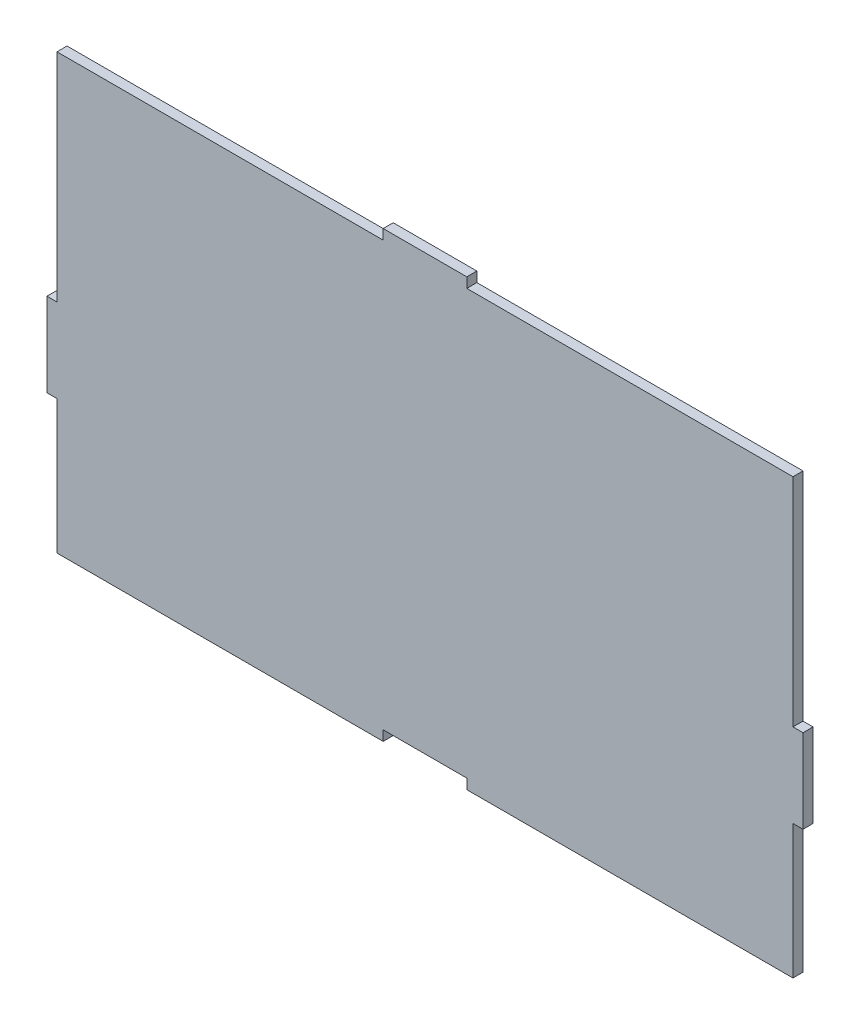
ISO-10303-21;
HEADER;
FILE_DESCRIPTION(('STEP AP214'),'2;1');
FILE_NAME('part.step','',(''),(''),'','','');
FILE_SCHEMA(('AUTOMOTIVE_DESIGN { 1 0 10303 214 1 1 1 1 }'));
ENDSEC;
DATA;
#1=APPLICATION_CONTEXT('core data for automotive mechanical design processes');
#2=APPLICATION_PROTOCOL_DEFINITION('international standard','automotive_design',2000,#1);
#3=PRODUCT_CONTEXT('',#1,'mechanical');
#4=PRODUCT('Part','Part','',(#3));
#5=PRODUCT_RELATED_PRODUCT_CATEGORY('part','',(#4));
#6=PRODUCT_DEFINITION_FORMATION('','',#4);
#7=PRODUCT_DEFINITION_CONTEXT('part definition',#1,'design');
#8=PRODUCT_DEFINITION('design','',#6,#7);
#9=PRODUCT_DEFINITION_SHAPE('','',#8);
#10=(LENGTH_UNIT() NAMED_UNIT(*) SI_UNIT(.MILLI.,.METRE.));
#11=(NAMED_UNIT(*) PLANE_ANGLE_UNIT() SI_UNIT($,.RADIAN.));
#12=(NAMED_UNIT(*) SI_UNIT($,.STERADIAN.) SOLID_ANGLE_UNIT());
#13=UNCERTAINTY_MEASURE_WITH_UNIT(LENGTH_MEASURE(1.E-05),#10,'distance_accuracy_value','');
#14=(GEOMETRIC_REPRESENTATION_CONTEXT(3) GLOBAL_UNCERTAINTY_ASSIGNED_CONTEXT((#13)) GLOBAL_UNIT_ASSIGNED_CONTEXT((#10,
#11,#12)) REPRESENTATION_CONTEXT('',''));
#15=CARTESIAN_POINT('',(0.,0.,0.));
#16=DIRECTION('',(0.,0.,1.));
#17=DIRECTION('',(1.,0.,0.));
#18=AXIS2_PLACEMENT_3D('',#15,#16,#17);
#19=CARTESIAN_POINT('',(-115.213739234052,58.7272144342199,3.));
#20=DIRECTION('',(1.,0.,0.));
#21=DIRECTION('',(0.,1.,0.));
#22=AXIS2_PLACEMENT_3D('',#19,#20,#21);
#23=PLANE('',#22);
#24=DIRECTION('',(0.,-1.,0.));
#25=VECTOR('',#24,1.);
#26=CARTESIAN_POINT('',(-115.213739234052,58.7272144342199,0.));
#27=LINE('',#26,#25);
#28=CARTESIAN_POINT('',(-115.213739234052,58.7272144342199,0.));
#29=VERTEX_POINT('',#28);
#30=CARTESIAN_POINT('',(-115.213739234052,-6.04278556578011,0.));
#31=VERTEX_POINT('',#30);
#32=EDGE_CURVE('E203',#29,#31,#27,.T.);
#33=ORIENTED_EDGE('',*,*,#32,.T.);
#34=DIRECTION('',(0.,0.,-1.));
#35=VECTOR('',#34,1.);
#36=CARTESIAN_POINT('',(-115.213739234052,-6.04278556578011,3.));
#37=LINE('',#36,#35);
#38=CARTESIAN_POINT('',(-115.213739234052,-6.04278556578011,3.));
#39=VERTEX_POINT('',#38);
#40=EDGE_CURVE('E11',#39,#31,#37,.T.);
#41=ORIENTED_EDGE('',*,*,#40,.F.);
#42=DIRECTION('',(0.,-1.,0.));
#43=VECTOR('',#42,1.);
#44=CARTESIAN_POINT('',(-115.213739234052,58.7272144342199,3.));
#45=LINE('',#44,#43);
#46=CARTESIAN_POINT('',(-115.213739234052,58.7272144342199,3.));
#47=VERTEX_POINT('',#46);
#48=EDGE_CURVE('E241',#47,#39,#45,.T.);
#49=ORIENTED_EDGE('',*,*,#48,.F.);
#50=DIRECTION('',(0.,0.,-1.));
#51=VECTOR('',#50,1.);
#52=CARTESIAN_POINT('',(-115.213739234052,58.7272144342199,3.));
#53=LINE('',#52,#51);
#54=EDGE_CURVE('E199',#47,#29,#53,.T.);
#55=ORIENTED_EDGE('',*,*,#54,.T.);
#56=EDGE_LOOP('',(#33,#41,#49,#55));
#57=FACE_BOUND('',#56,.T.);
#58=ADVANCED_FACE('F35',(#57),#23,.F.);
#59=CARTESIAN_POINT('',(-118.213739234052,-6.04278556578011,3.));
#60=DIRECTION('',(0.,-1.,0.));
#61=DIRECTION('',(0.,0.,-1.));
#62=AXIS2_PLACEMENT_3D('',#59,#60,#61);
#63=PLANE('',#62);
#64=DIRECTION('',(-1.,0.,0.));
#65=VECTOR('',#64,1.);
#66=CARTESIAN_POINT('',(-118.213739234052,-6.04278556578011,0.));
#67=LINE('',#66,#65);
#68=CARTESIAN_POINT('',(-118.213739234052,-6.04278556578011,0.));
#69=VERTEX_POINT('',#68);
#70=EDGE_CURVE('E206',#31,#69,#67,.T.);
#71=ORIENTED_EDGE('',*,*,#70,.T.);
#72=DIRECTION('',(0.,0.,-1.));
#73=VECTOR('',#72,1.);
#74=CARTESIAN_POINT('',(-118.213739234052,-6.04278556578011,3.));
#75=LINE('',#74,#73);
#76=CARTESIAN_POINT('',(-118.213739234052,-6.04278556578011,3.));
#77=VERTEX_POINT('',#76);
#78=EDGE_CURVE('E43',#77,#69,#75,.T.);
#79=ORIENTED_EDGE('',*,*,#78,.F.);
#80=DIRECTION('',(-1.,0.,0.));
#81=VECTOR('',#80,1.);
#82=CARTESIAN_POINT('',(-118.213739234052,-6.04278556578011,3.));
#83=LINE('',#82,#81);
#84=EDGE_CURVE('E130',#39,#77,#83,.T.);
#85=ORIENTED_EDGE('',*,*,#84,.F.);
#86=ORIENTED_EDGE('',*,*,#40,.T.);
#87=EDGE_LOOP('',(#71,#79,#85,#86));
#88=FACE_BOUND('',#87,.T.);
#89=ADVANCED_FACE('F359',(#88),#63,.F.);
#90=CARTESIAN_POINT('',(-118.213739234052,-6.04278556578011,3.));
#91=DIRECTION('',(1.,0.,0.));
#92=DIRECTION('',(0.,0.,-1.));
#93=AXIS2_PLACEMENT_3D('',#90,#91,#92);
#94=PLANE('',#93);
#95=DIRECTION('',(0.,-1.,0.));
#96=VECTOR('',#95,1.);
#97=CARTESIAN_POINT('',(-118.213739234052,-6.04278556578011,0.));
#98=LINE('',#97,#96);
#99=CARTESIAN_POINT('',(-118.213739234052,-31.0427855657801,0.));
#100=VERTEX_POINT('',#99);
#101=EDGE_CURVE('E208',#69,#100,#98,.T.);
#102=ORIENTED_EDGE('',*,*,#101,.T.);
#103=DIRECTION('',(0.,0.,-1.));
#104=VECTOR('',#103,1.);
#105=CARTESIAN_POINT('',(-118.213739234052,-31.0427855657801,3.));
#106=LINE('',#105,#104);
#107=CARTESIAN_POINT('',(-118.213739234052,-31.0427855657801,3.));
#108=VERTEX_POINT('',#107);
#109=EDGE_CURVE('E284',#108,#100,#106,.T.);
#110=ORIENTED_EDGE('',*,*,#109,.F.);
#111=DIRECTION('',(0.,-1.,0.));
#112=VECTOR('',#111,1.);
#113=CARTESIAN_POINT('',(-118.213739234052,-6.04278556578011,3.));
#114=LINE('',#113,#112);
#115=EDGE_CURVE('E292',#77,#108,#114,.T.);
#116=ORIENTED_EDGE('',*,*,#115,.F.);
#117=ORIENTED_EDGE('',*,*,#78,.T.);
#118=EDGE_LOOP('',(#102,#110,#116,#117));
#119=FACE_BOUND('',#118,.T.);
#120=ADVANCED_FACE('F290',(#119),#94,.F.);
#121=CARTESIAN_POINT('',(-118.213739234052,-31.0427855657801,3.));
#122=DIRECTION('',(0.,1.,0.));
#123=DIRECTION('',(0.,0.,1.));
#124=AXIS2_PLACEMENT_3D('',#121,#122,#123);
#125=PLANE('',#124);
#126=DIRECTION('',(1.,0.,0.));
#127=VECTOR('',#126,1.);
#128=CARTESIAN_POINT('',(-118.213739234052,-31.0427855657801,0.));
#129=LINE('',#128,#127);
#130=CARTESIAN_POINT('',(-115.213739234052,-31.0427855657801,0.));
#131=VERTEX_POINT('',#130);
#132=EDGE_CURVE('E210',#100,#131,#129,.T.);
#133=ORIENTED_EDGE('',*,*,#132,.T.);
#134=DIRECTION('',(0.,0.,-1.));
#135=VECTOR('',#134,1.);
#136=CARTESIAN_POINT('',(-115.213739234052,-31.0427855657801,3.));
#137=LINE('',#136,#135);
#138=CARTESIAN_POINT('',(-115.213739234052,-31.0427855657801,3.));
#139=VERTEX_POINT('',#138);
#140=EDGE_CURVE('E281',#139,#131,#137,.T.);
#141=ORIENTED_EDGE('',*,*,#140,.F.);
#142=DIRECTION('',(1.,0.,0.));
#143=VECTOR('',#142,1.);
#144=CARTESIAN_POINT('',(-118.213739234052,-31.0427855657801,3.));
#145=LINE('',#144,#143);
#146=EDGE_CURVE('E310',#108,#139,#145,.T.);
#147=ORIENTED_EDGE('',*,*,#146,.F.);
#148=ORIENTED_EDGE('',*,*,#109,.T.);
#149=EDGE_LOOP('',(#133,#141,#147,#148));
#150=FACE_BOUND('',#149,.T.);
#151=ADVANCED_FACE('F301',(#150),#125,.F.);
#152=CARTESIAN_POINT('',(-115.213739234052,-31.0427855657801,3.));
#153=DIRECTION('',(1.,0.,0.));
#154=DIRECTION('',(0.,0.,-1.));
#155=AXIS2_PLACEMENT_3D('',#152,#153,#154);
#156=PLANE('',#155);
#157=DIRECTION('',(0.,-1.,0.));
#158=VECTOR('',#157,1.);
#159=CARTESIAN_POINT('',(-115.213739234052,-31.0427855657801,0.));
#160=LINE('',#159,#158);
#161=CARTESIAN_POINT('',(-115.213739234052,-71.0427855657801,0.));
#162=VERTEX_POINT('',#161);
#163=EDGE_CURVE('E212',#131,#162,#160,.T.);
#164=ORIENTED_EDGE('',*,*,#163,.T.);
#165=DIRECTION('',(0.,0.,-1.));
#166=VECTOR('',#165,1.);
#167=CARTESIAN_POINT('',(-115.213739234052,-71.0427855657801,3.));
#168=LINE('',#167,#166);
#169=CARTESIAN_POINT('',(-115.213739234052,-71.0427855657801,3.));
#170=VERTEX_POINT('',#169);
#171=EDGE_CURVE('E278',#170,#162,#168,.T.);
#172=ORIENTED_EDGE('',*,*,#171,.F.);
#173=DIRECTION('',(0.,-1.,0.));
#174=VECTOR('',#173,1.);
#175=CARTESIAN_POINT('',(-115.213739234052,-31.0427855657801,3.));
#176=LINE('',#175,#174);
#177=EDGE_CURVE('E307',#139,#170,#176,.T.);
#178=ORIENTED_EDGE('',*,*,#177,.F.);
#179=ORIENTED_EDGE('',*,*,#140,.T.);
#180=EDGE_LOOP('',(#164,#172,#178,#179));
#181=FACE_BOUND('',#180,.T.);
#182=ADVANCED_FACE('F305',(#181),#156,.F.);
#183=CARTESIAN_POINT('',(-115.213739234052,-71.0427855657801,3.));
#184=DIRECTION('',(0.,1.,0.));
#185=DIRECTION('',(-1.,0.,0.));
#186=AXIS2_PLACEMENT_3D('',#183,#184,#185);
#187=PLANE('',#186);
#188=DIRECTION('',(1.,0.,0.));
#189=VECTOR('',#188,1.);
#190=CARTESIAN_POINT('',(-115.213739234052,-71.0427855657801,0.));
#191=LINE('',#190,#189);
#192=CARTESIAN_POINT('',(-17.7137392340518,-71.0427855657801,0.));
#193=VERTEX_POINT('',#192);
#194=EDGE_CURVE('E214',#162,#193,#191,.T.);
#195=ORIENTED_EDGE('',*,*,#194,.T.);
#196=DIRECTION('',(0.,0.,-1.));
#197=VECTOR('',#196,1.);
#198=CARTESIAN_POINT('',(-17.7137392340518,-71.0427855657801,3.));
#199=LINE('',#198,#197);
#200=CARTESIAN_POINT('',(-17.7137392340518,-71.0427855657801,3.));
#201=VERTEX_POINT('',#200);
#202=EDGE_CURVE('E275',#201,#193,#199,.T.);
#203=ORIENTED_EDGE('',*,*,#202,.F.);
#204=DIRECTION('',(1.,0.,0.));
#205=VECTOR('',#204,1.);
#206=CARTESIAN_POINT('',(-115.213739234052,-71.0427855657801,3.));
#207=LINE('',#206,#205);
#208=EDGE_CURVE('E309',#170,#201,#207,.T.);
#209=ORIENTED_EDGE('',*,*,#208,.F.);
#210=ORIENTED_EDGE('',*,*,#171,.T.);
#211=EDGE_LOOP('',(#195,#203,#209,#210));
#212=FACE_BOUND('',#211,.T.);
#213=ADVANCED_FACE('F372',(#212),#187,.F.);
#214=CARTESIAN_POINT('',(-17.7137392340518,-71.0427855657801,3.));
#215=DIRECTION('',(-1.,0.,0.));
#216=DIRECTION('',(0.,-1.,0.));
#217=AXIS2_PLACEMENT_3D('',#214,#215,#216);
#218=PLANE('',#217);
#219=DIRECTION('',(0.,1.,0.));
#220=VECTOR('',#219,1.);
#221=CARTESIAN_POINT('',(-17.7137392340518,-71.0427855657801,0.));
#222=LINE('',#221,#220);
#223=CARTESIAN_POINT('',(-17.7137392340518,-68.04278556578,0.));
#224=VERTEX_POINT('',#223);
#225=EDGE_CURVE('E216',#193,#224,#222,.T.);
#226=ORIENTED_EDGE('',*,*,#225,.T.);
#227=DIRECTION('',(0.,0.,-1.));
#228=VECTOR('',#227,1.);
#229=CARTESIAN_POINT('',(-17.7137392340518,-68.04278556578,3.));
#230=LINE('',#229,#228);
#231=CARTESIAN_POINT('',(-17.7137392340518,-68.04278556578,3.));
#232=VERTEX_POINT('',#231);
#233=EDGE_CURVE('E272',#232,#224,#230,.T.);
#234=ORIENTED_EDGE('',*,*,#233,.F.);
#235=DIRECTION('',(0.,1.,0.));
#236=VECTOR('',#235,1.);
#237=CARTESIAN_POINT('',(-17.7137392340518,-71.0427855657801,3.));
#238=LINE('',#237,#236);
#239=EDGE_CURVE('E312',#201,#232,#238,.T.);
#240=ORIENTED_EDGE('',*,*,#239,.F.);
#241=ORIENTED_EDGE('',*,*,#202,.T.);
#242=EDGE_LOOP('',(#226,#234,#240,#241));
#243=FACE_BOUND('',#242,.T.);
#244=ADVANCED_FACE('F375',(#243),#218,.F.);
#245=CARTESIAN_POINT('',(-17.7137392340518,-68.04278556578,3.));
#246=DIRECTION('',(0.,1.,0.));
#247=DIRECTION('',(0.,0.,1.));
#248=AXIS2_PLACEMENT_3D('',#245,#246,#247);
#249=PLANE('',#248);
#250=DIRECTION('',(1.,0.,0.));
#251=VECTOR('',#250,1.);
#252=CARTESIAN_POINT('',(-17.7137392340518,-68.04278556578,0.));
#253=LINE('',#252,#251);
#254=CARTESIAN_POINT('',(7.28626076594825,-68.04278556578,0.));
#255=VERTEX_POINT('',#254);
#256=EDGE_CURVE('E218',#224,#255,#253,.T.);
#257=ORIENTED_EDGE('',*,*,#256,.T.);
#258=DIRECTION('',(0.,0.,-1.));
#259=VECTOR('',#258,1.);
#260=CARTESIAN_POINT('',(7.28626076594825,-68.04278556578,3.));
#261=LINE('',#260,#259);
#262=CARTESIAN_POINT('',(7.28626076594825,-68.04278556578,3.));
#263=VERTEX_POINT('',#262);
#264=EDGE_CURVE('E269',#263,#255,#261,.T.);
#265=ORIENTED_EDGE('',*,*,#264,.F.);
#266=DIRECTION('',(1.,0.,0.));
#267=VECTOR('',#266,1.);
#268=CARTESIAN_POINT('',(-17.7137392340518,-68.04278556578,3.));
#269=LINE('',#268,#267);
#270=EDGE_CURVE('E318',#232,#263,#269,.T.);
#271=ORIENTED_EDGE('',*,*,#270,.F.);
#272=ORIENTED_EDGE('',*,*,#233,.T.);
#273=EDGE_LOOP('',(#257,#265,#271,#272));
#274=FACE_BOUND('',#273,.T.);
#275=ADVANCED_FACE('F379',(#274),#249,.F.);
#276=CARTESIAN_POINT('',(7.28626076594825,-71.0427855657801,3.));
#277=DIRECTION('',(1.,0.,0.));
#278=DIRECTION('',(0.,0.,-1.));
#279=AXIS2_PLACEMENT_3D('',#276,#277,#278);
#280=PLANE('',#279);
#281=DIRECTION('',(0.,-1.,0.));
#282=VECTOR('',#281,1.);
#283=CARTESIAN_POINT('',(7.28626076594825,-71.0427855657801,0.));
#284=LINE('',#283,#282);
#285=CARTESIAN_POINT('',(7.28626076594825,-71.0427855657801,0.));
#286=VERTEX_POINT('',#285);
#287=EDGE_CURVE('E220',#255,#286,#284,.T.);
#288=ORIENTED_EDGE('',*,*,#287,.T.);
#289=DIRECTION('',(0.,0.,-1.));
#290=VECTOR('',#289,1.);
#291=CARTESIAN_POINT('',(7.28626076594825,-71.0427855657801,3.));
#292=LINE('',#291,#290);
#293=CARTESIAN_POINT('',(7.28626076594825,-71.0427855657801,3.));
#294=VERTEX_POINT('',#293);
#295=EDGE_CURVE('E266',#294,#286,#292,.T.);
#296=ORIENTED_EDGE('',*,*,#295,.F.);
#297=DIRECTION('',(0.,-1.,0.));
#298=VECTOR('',#297,1.);
#299=CARTESIAN_POINT('',(7.28626076594825,-71.0427855657801,3.));
#300=LINE('',#299,#298);
#301=EDGE_CURVE('E320',#263,#294,#300,.T.);
#302=ORIENTED_EDGE('',*,*,#301,.F.);
#303=ORIENTED_EDGE('',*,*,#264,.T.);
#304=EDGE_LOOP('',(#288,#296,#302,#303));
#305=FACE_BOUND('',#304,.T.);
#306=ADVANCED_FACE('F383',(#305),#280,.F.);
#307=CARTESIAN_POINT('',(7.28626076594825,-71.0427855657801,3.));
#308=DIRECTION('',(0.,1.,0.));
#309=DIRECTION('',(-1.,0.,0.));
#310=AXIS2_PLACEMENT_3D('',#307,#308,#309);
#311=PLANE('',#310);
#312=DIRECTION('',(1.,0.,0.));
#313=VECTOR('',#312,1.);
#314=CARTESIAN_POINT('',(7.28626076594825,-71.0427855657801,0.));
#315=LINE('',#314,#313);
#316=CARTESIAN_POINT('',(104.786260765948,-71.0427855657801,0.));
#317=VERTEX_POINT('',#316);
#318=EDGE_CURVE('E222',#286,#317,#315,.T.);
#319=ORIENTED_EDGE('',*,*,#318,.T.);
#320=DIRECTION('',(0.,0.,-1.));
#321=VECTOR('',#320,1.);
#322=CARTESIAN_POINT('',(104.786260765948,-71.0427855657801,3.));
#323=LINE('',#322,#321);
#324=CARTESIAN_POINT('',(104.786260765948,-71.0427855657801,3.));
#325=VERTEX_POINT('',#324);
#326=EDGE_CURVE('E263',#325,#317,#323,.T.);
#327=ORIENTED_EDGE('',*,*,#326,.F.);
#328=DIRECTION('',(1.,0.,0.));
#329=VECTOR('',#328,1.);
#330=CARTESIAN_POINT('',(7.28626076594825,-71.0427855657801,3.));
#331=LINE('',#330,#329);
#332=EDGE_CURVE('E322',#294,#325,#331,.T.);
#333=ORIENTED_EDGE('',*,*,#332,.F.);
#334=ORIENTED_EDGE('',*,*,#295,.T.);
#335=EDGE_LOOP('',(#319,#327,#333,#334));
#336=FACE_BOUND('',#335,.T.);
#337=ADVANCED_FACE('F387',(#336),#311,.F.);
#338=CARTESIAN_POINT('',(104.786260765948,-31.0427855657801,3.));
#339=DIRECTION('',(-1.,0.,0.));
#340=DIRECTION('',(0.,-1.,0.));
#341=AXIS2_PLACEMENT_3D('',#338,#339,#340);
#342=PLANE('',#341);
#343=DIRECTION('',(0.,1.,0.));
#344=VECTOR('',#343,1.);
#345=CARTESIAN_POINT('',(104.786260765948,-31.0427855657801,0.));
#346=LINE('',#345,#344);
#347=CARTESIAN_POINT('',(104.786260765948,-31.0427855657801,0.));
#348=VERTEX_POINT('',#347);
#349=EDGE_CURVE('E224',#317,#348,#346,.T.);
#350=ORIENTED_EDGE('',*,*,#349,.T.);
#351=DIRECTION('',(0.,0.,-1.));
#352=VECTOR('',#351,1.);
#353=CARTESIAN_POINT('',(104.786260765948,-31.0427855657801,3.));
#354=LINE('',#353,#352);
#355=CARTESIAN_POINT('',(104.786260765948,-31.0427855657801,3.));
#356=VERTEX_POINT('',#355);
#357=EDGE_CURVE('E260',#356,#348,#354,.T.);
#358=ORIENTED_EDGE('',*,*,#357,.F.);
#359=DIRECTION('',(0.,1.,0.));
#360=VECTOR('',#359,1.);
#361=CARTESIAN_POINT('',(104.786260765948,-31.0427855657801,3.));
#362=LINE('',#361,#360);
#363=EDGE_CURVE('E324',#325,#356,#362,.T.);
#364=ORIENTED_EDGE('',*,*,#363,.F.);
#365=ORIENTED_EDGE('',*,*,#326,.T.);
#366=EDGE_LOOP('',(#350,#358,#364,#365));
#367=FACE_BOUND('',#366,.T.);
#368=ADVANCED_FACE('F391',(#367),#342,.F.);
#369=CARTESIAN_POINT('',(104.786260765948,-31.0427855657801,3.));
#370=DIRECTION('',(0.,1.,0.));
#371=DIRECTION('',(0.,0.,1.));
#372=AXIS2_PLACEMENT_3D('',#369,#370,#371);
#373=PLANE('',#372);
#374=DIRECTION('',(1.,0.,0.));
#375=VECTOR('',#374,1.);
#376=CARTESIAN_POINT('',(104.786260765948,-31.0427855657801,0.));
#377=LINE('',#376,#375);
#378=CARTESIAN_POINT('',(107.786260765948,-31.0427855657801,0.));
#379=VERTEX_POINT('',#378);
#380=EDGE_CURVE('E226',#348,#379,#377,.T.);
#381=ORIENTED_EDGE('',*,*,#380,.T.);
#382=DIRECTION('',(0.,0.,-1.));
#383=VECTOR('',#382,1.);
#384=CARTESIAN_POINT('',(107.786260765948,-31.0427855657801,3.));
#385=LINE('',#384,#383);
#386=CARTESIAN_POINT('',(107.786260765948,-31.0427855657801,3.));
#387=VERTEX_POINT('',#386);
#388=EDGE_CURVE('E257',#387,#379,#385,.T.);
#389=ORIENTED_EDGE('',*,*,#388,.F.);
#390=DIRECTION('',(1.,0.,0.));
#391=VECTOR('',#390,1.);
#392=CARTESIAN_POINT('',(104.786260765948,-31.0427855657801,3.));
#393=LINE('',#392,#391);
#394=EDGE_CURVE('E326',#356,#387,#393,.T.);
#395=ORIENTED_EDGE('',*,*,#394,.F.);
#396=ORIENTED_EDGE('',*,*,#357,.T.);
#397=EDGE_LOOP('',(#381,#389,#395,#396));
#398=FACE_BOUND('',#397,.T.);
#399=ADVANCED_FACE('F395',(#398),#373,.F.);
#400=CARTESIAN_POINT('',(107.786260765948,-6.04278556578011,3.));
#401=DIRECTION('',(-1.,0.,0.));
#402=DIRECTION('',(0.,-1.,0.));
#403=AXIS2_PLACEMENT_3D('',#400,#401,#402);
#404=PLANE('',#403);
#405=DIRECTION('',(0.,1.,0.));
#406=VECTOR('',#405,1.);
#407=CARTESIAN_POINT('',(107.786260765948,-6.04278556578011,0.));
#408=LINE('',#407,#406);
#409=CARTESIAN_POINT('',(107.786260765948,-6.04278556578011,0.));
#410=VERTEX_POINT('',#409);
#411=EDGE_CURVE('E228',#379,#410,#408,.T.);
#412=ORIENTED_EDGE('',*,*,#411,.T.);
#413=DIRECTION('',(0.,0.,-1.));
#414=VECTOR('',#413,1.);
#415=CARTESIAN_POINT('',(107.786260765948,-6.04278556578011,3.));
#416=LINE('',#415,#414);
#417=CARTESIAN_POINT('',(107.786260765948,-6.04278556578011,3.));
#418=VERTEX_POINT('',#417);
#419=EDGE_CURVE('E254',#418,#410,#416,.T.);
#420=ORIENTED_EDGE('',*,*,#419,.F.);
#421=DIRECTION('',(0.,1.,0.));
#422=VECTOR('',#421,1.);
#423=CARTESIAN_POINT('',(107.786260765948,-6.04278556578011,3.));
#424=LINE('',#423,#422);
#425=EDGE_CURVE('E328',#387,#418,#424,.T.);
#426=ORIENTED_EDGE('',*,*,#425,.F.);
#427=ORIENTED_EDGE('',*,*,#388,.T.);
#428=EDGE_LOOP('',(#412,#420,#426,#427));
#429=FACE_BOUND('',#428,.T.);
#430=ADVANCED_FACE('F399',(#429),#404,.F.);
#431=CARTESIAN_POINT('',(104.786260765948,-6.04278556578011,3.));
#432=DIRECTION('',(0.,-1.,0.));
#433=DIRECTION('',(1.,0.,0.));
#434=AXIS2_PLACEMENT_3D('',#431,#432,#433);
#435=PLANE('',#434);
#436=DIRECTION('',(-1.,0.,0.));
#437=VECTOR('',#436,1.);
#438=CARTESIAN_POINT('',(104.786260765948,-6.04278556578011,0.));
#439=LINE('',#438,#437);
#440=CARTESIAN_POINT('',(104.786260765948,-6.04278556578011,0.));
#441=VERTEX_POINT('',#440);
#442=EDGE_CURVE('E230',#410,#441,#439,.T.);
#443=ORIENTED_EDGE('',*,*,#442,.T.);
#444=DIRECTION('',(0.,0.,-1.));
#445=VECTOR('',#444,1.);
#446=CARTESIAN_POINT('',(104.786260765948,-6.04278556578011,3.));
#447=LINE('',#446,#445);
#448=CARTESIAN_POINT('',(104.786260765948,-6.04278556578011,3.));
#449=VERTEX_POINT('',#448);
#450=EDGE_CURVE('E251',#449,#441,#447,.T.);
#451=ORIENTED_EDGE('',*,*,#450,.F.);
#452=DIRECTION('',(-1.,0.,0.));
#453=VECTOR('',#452,1.);
#454=CARTESIAN_POINT('',(104.786260765948,-6.04278556578011,3.));
#455=LINE('',#454,#453);
#456=EDGE_CURVE('E330',#418,#449,#455,.T.);
#457=ORIENTED_EDGE('',*,*,#456,.F.);
#458=ORIENTED_EDGE('',*,*,#419,.T.);
#459=EDGE_LOOP('',(#443,#451,#457,#458));
#460=FACE_BOUND('',#459,.T.);
#461=ADVANCED_FACE('F403',(#460),#435,.F.);
#462=CARTESIAN_POINT('',(104.786260765948,58.7272144342199,3.));
#463=DIRECTION('',(-1.,0.,0.));
#464=DIRECTION('',(0.,-1.,0.));
#465=AXIS2_PLACEMENT_3D('',#462,#463,#464);
#466=PLANE('',#465);
#467=DIRECTION('',(0.,1.,0.));
#468=VECTOR('',#467,1.);
#469=CARTESIAN_POINT('',(104.786260765948,58.7272144342199,0.));
#470=LINE('',#469,#468);
#471=CARTESIAN_POINT('',(104.786260765948,58.7272144342199,0.));
#472=VERTEX_POINT('',#471);
#473=EDGE_CURVE('E232',#441,#472,#470,.T.);
#474=ORIENTED_EDGE('',*,*,#473,.T.);
#475=DIRECTION('',(0.,0.,-1.));
#476=VECTOR('',#475,1.);
#477=CARTESIAN_POINT('',(104.786260765948,58.7272144342199,3.));
#478=LINE('',#477,#476);
#479=CARTESIAN_POINT('',(104.786260765948,58.7272144342199,3.));
#480=VERTEX_POINT('',#479);
#481=EDGE_CURVE('E248',#480,#472,#478,.T.);
#482=ORIENTED_EDGE('',*,*,#481,.F.);
#483=DIRECTION('',(0.,1.,0.));
#484=VECTOR('',#483,1.);
#485=CARTESIAN_POINT('',(104.786260765948,58.7272144342199,3.));
#486=LINE('',#485,#484);
#487=EDGE_CURVE('E332',#449,#480,#486,.T.);
#488=ORIENTED_EDGE('',*,*,#487,.F.);
#489=ORIENTED_EDGE('',*,*,#450,.T.);
#490=EDGE_LOOP('',(#474,#482,#488,#489));
#491=FACE_BOUND('',#490,.T.);
#492=ADVANCED_FACE('F407',(#491),#466,.F.);
#493=CARTESIAN_POINT('',(7.28626076594821,58.7272144342199,3.));
#494=DIRECTION('',(0.,-1.,0.));
#495=DIRECTION('',(0.,0.,-1.));
#496=AXIS2_PLACEMENT_3D('',#493,#494,#495);
#497=PLANE('',#496);
#498=DIRECTION('',(-1.,0.,0.));
#499=VECTOR('',#498,1.);
#500=CARTESIAN_POINT('',(7.28626076594821,58.7272144342199,0.));
#501=LINE('',#500,#499);
#502=CARTESIAN_POINT('',(7.28626076594821,58.7272144342199,0.));
#503=VERTEX_POINT('',#502);
#504=EDGE_CURVE('E234',#472,#503,#501,.T.);
#505=ORIENTED_EDGE('',*,*,#504,.T.);
#506=DIRECTION('',(0.,0.,-1.));
#507=VECTOR('',#506,1.);
#508=CARTESIAN_POINT('',(7.28626076594821,58.7272144342199,3.));
#509=LINE('',#508,#507);
#510=CARTESIAN_POINT('',(7.28626076594821,58.7272144342199,3.));
#511=VERTEX_POINT('',#510);
#512=EDGE_CURVE('E245',#511,#503,#509,.T.);
#513=ORIENTED_EDGE('',*,*,#512,.F.);
#514=DIRECTION('',(-1.,0.,0.));
#515=VECTOR('',#514,1.);
#516=CARTESIAN_POINT('',(7.28626076594821,58.7272144342199,3.));
#517=LINE('',#516,#515);
#518=EDGE_CURVE('E334',#480,#511,#517,.T.);
#519=ORIENTED_EDGE('',*,*,#518,.F.);
#520=ORIENTED_EDGE('',*,*,#481,.T.);
#521=EDGE_LOOP('',(#505,#513,#519,#520));
#522=FACE_BOUND('',#521,.T.);
#523=ADVANCED_FACE('F340',(#522),#497,.F.);
#524=CARTESIAN_POINT('',(7.28626076594821,58.7272144342199,3.));
#525=DIRECTION('',(-1.,0.,0.));
#526=DIRECTION('',(0.,0.,1.));
#527=AXIS2_PLACEMENT_3D('',#524,#525,#526);
#528=PLANE('',#527);
#529=DIRECTION('',(0.,1.,0.));
#530=VECTOR('',#529,1.);
#531=CARTESIAN_POINT('',(7.28626076594821,58.7272144342199,0.));
#532=LINE('',#531,#530);
#533=CARTESIAN_POINT('',(7.28626076594821,61.72721443422,0.));
#534=VERTEX_POINT('',#533);
#535=EDGE_CURVE('E236',#503,#534,#532,.T.);
#536=ORIENTED_EDGE('',*,*,#535,.T.);
#537=DIRECTION('',(0.,0.,-1.));
#538=VECTOR('',#537,1.);
#539=CARTESIAN_POINT('',(7.28626076594821,61.72721443422,3.));
#540=LINE('',#539,#538);
#541=CARTESIAN_POINT('',(7.28626076594821,61.72721443422,3.));
#542=VERTEX_POINT('',#541);
#543=EDGE_CURVE('E194',#542,#534,#540,.T.);
#544=ORIENTED_EDGE('',*,*,#543,.F.);
#545=DIRECTION('',(0.,1.,0.));
#546=VECTOR('',#545,1.);
#547=CARTESIAN_POINT('',(7.28626076594821,58.7272144342199,3.));
#548=LINE('',#547,#546);
#549=EDGE_CURVE('E185',#511,#542,#548,.T.);
#550=ORIENTED_EDGE('',*,*,#549,.F.);
#551=ORIENTED_EDGE('',*,*,#512,.T.);
#552=EDGE_LOOP('',(#536,#544,#550,#551));
#553=FACE_BOUND('',#552,.T.);
#554=ADVANCED_FACE('F344',(#553),#528,.F.);
#555=CARTESIAN_POINT('',(-17.7137392340518,61.72721443422,3.));
#556=DIRECTION('',(0.,-1.,0.));
#557=DIRECTION('',(1.,0.,0.));
#558=AXIS2_PLACEMENT_3D('',#555,#556,#557);
#559=PLANE('',#558);
#560=DIRECTION('',(-1.,0.,0.));
#561=VECTOR('',#560,1.);
#562=CARTESIAN_POINT('',(-17.7137392340518,61.72721443422,0.));
#563=LINE('',#562,#561);
#564=CARTESIAN_POINT('',(-17.7137392340518,61.72721443422,0.));
#565=VERTEX_POINT('',#564);
#566=EDGE_CURVE('E193',#534,#565,#563,.T.);
#567=ORIENTED_EDGE('',*,*,#566,.T.);
#568=DIRECTION('',(0.,0.,-1.));
#569=VECTOR('',#568,1.);
#570=CARTESIAN_POINT('',(-17.7137392340518,61.72721443422,3.));
#571=LINE('',#570,#569);
#572=CARTESIAN_POINT('',(-17.7137392340518,61.72721443422,3.));
#573=VERTEX_POINT('',#572);
#574=EDGE_CURVE('E190',#573,#565,#571,.T.);
#575=ORIENTED_EDGE('',*,*,#574,.F.);
#576=DIRECTION('',(-1.,0.,0.));
#577=VECTOR('',#576,1.);
#578=CARTESIAN_POINT('',(-17.7137392340518,61.72721443422,3.));
#579=LINE('',#578,#577);
#580=EDGE_CURVE('E179',#542,#573,#579,.T.);
#581=ORIENTED_EDGE('',*,*,#580,.F.);
#582=ORIENTED_EDGE('',*,*,#543,.T.);
#583=EDGE_LOOP('',(#567,#575,#581,#582));
#584=FACE_BOUND('',#583,.T.);
#585=ADVANCED_FACE('F191',(#584),#559,.F.);
#586=CARTESIAN_POINT('',(-17.7137392340518,58.7272144342199,3.));
#587=DIRECTION('',(1.,0.,0.));
#588=DIRECTION('',(0.,0.,-1.));
#589=AXIS2_PLACEMENT_3D('',#586,#587,#588);
#590=PLANE('',#589);
#591=DIRECTION('',(0.,-1.,0.));
#592=VECTOR('',#591,1.);
#593=CARTESIAN_POINT('',(-17.7137392340518,58.7272144342199,0.));
#594=LINE('',#593,#592);
#595=CARTESIAN_POINT('',(-17.7137392340518,58.7272144342199,0.));
#596=VERTEX_POINT('',#595);
#597=EDGE_CURVE('E116',#565,#596,#594,.T.);
#598=ORIENTED_EDGE('',*,*,#597,.T.);
#599=DIRECTION('',(0.,0.,-1.));
#600=VECTOR('',#599,1.);
#601=CARTESIAN_POINT('',(-17.7137392340518,58.7272144342199,3.));
#602=LINE('',#601,#600);
#603=CARTESIAN_POINT('',(-17.7137392340518,58.7272144342199,3.));
#604=VERTEX_POINT('',#603);
#605=EDGE_CURVE('E195',#604,#596,#602,.T.);
#606=ORIENTED_EDGE('',*,*,#605,.F.);
#607=DIRECTION('',(0.,-1.,0.));
#608=VECTOR('',#607,1.);
#609=CARTESIAN_POINT('',(-17.7137392340518,58.7272144342199,3.));
#610=LINE('',#609,#608);
#611=EDGE_CURVE('E183',#573,#604,#610,.T.);
#612=ORIENTED_EDGE('',*,*,#611,.F.);
#613=ORIENTED_EDGE('',*,*,#574,.T.);
#614=EDGE_LOOP('',(#598,#606,#612,#613));
#615=FACE_BOUND('',#614,.T.);
#616=ADVANCED_FACE('F197',(#615),#590,.F.);
#617=CARTESIAN_POINT('',(-115.213739234052,58.7272144342199,3.));
#618=DIRECTION('',(0.,-1.,0.));
#619=DIRECTION('',(0.,0.,-1.));
#620=AXIS2_PLACEMENT_3D('',#617,#618,#619);
#621=PLANE('',#620);
#622=DIRECTION('',(-1.,0.,0.));
#623=VECTOR('',#622,1.);
#624=CARTESIAN_POINT('',(-115.213739234052,58.7272144342199,0.));
#625=LINE('',#624,#623);
#626=EDGE_CURVE('E122',#596,#29,#625,.T.);
#627=ORIENTED_EDGE('',*,*,#626,.T.);
#628=ORIENTED_EDGE('',*,*,#54,.F.);
#629=DIRECTION('',(-1.,0.,0.));
#630=VECTOR('',#629,1.);
#631=CARTESIAN_POINT('',(-115.213739234052,58.7272144342199,3.));
#632=LINE('',#631,#630);
#633=EDGE_CURVE('E51',#604,#47,#632,.T.);
#634=ORIENTED_EDGE('',*,*,#633,.F.);
#635=ORIENTED_EDGE('',*,*,#605,.T.);
#636=EDGE_LOOP('',(#627,#628,#634,#635));
#637=FACE_BOUND('',#636,.T.);
#638=ADVANCED_FACE('F348',(#637),#621,.F.);
#639=CARTESIAN_POINT('',(0.,0.,3.));
#640=DIRECTION('',(0.,0.,1.));
#641=DIRECTION('',(1.,0.,0.));
#642=AXIS2_PLACEMENT_3D('',#639,#640,#641);
#643=PLANE('',#642);
#644=ORIENTED_EDGE('',*,*,#48,.T.);
#645=ORIENTED_EDGE('',*,*,#84,.T.);
#646=ORIENTED_EDGE('',*,*,#115,.T.);
#647=ORIENTED_EDGE('',*,*,#146,.T.);
#648=ORIENTED_EDGE('',*,*,#177,.T.);
#649=ORIENTED_EDGE('',*,*,#208,.T.);
#650=ORIENTED_EDGE('',*,*,#239,.T.);
#651=ORIENTED_EDGE('',*,*,#270,.T.);
#652=ORIENTED_EDGE('',*,*,#301,.T.);
#653=ORIENTED_EDGE('',*,*,#332,.T.);
#654=ORIENTED_EDGE('',*,*,#363,.T.);
#655=ORIENTED_EDGE('',*,*,#394,.T.);
#656=ORIENTED_EDGE('',*,*,#425,.T.);
#657=ORIENTED_EDGE('',*,*,#456,.T.);
#658=ORIENTED_EDGE('',*,*,#487,.T.);
#659=ORIENTED_EDGE('',*,*,#518,.T.);
#660=ORIENTED_EDGE('',*,*,#549,.T.);
#661=ORIENTED_EDGE('',*,*,#580,.T.);
#662=ORIENTED_EDGE('',*,*,#611,.T.);
#663=ORIENTED_EDGE('',*,*,#633,.T.);
#664=EDGE_LOOP('',(#644,#645,#646,#647,#648,#649,#650,#651,#652,#653,#654,#655,#656,#657,#658,
#659,#660,#661,#662,#663));
#665=FACE_BOUND('',#664,.T.);
#666=ADVANCED_FACE('F181',(#665),#643,.T.);
#667=CARTESIAN_POINT('',(0.,0.,0.));
#668=DIRECTION('',(0.,0.,1.));
#669=DIRECTION('',(1.,0.,0.));
#670=AXIS2_PLACEMENT_3D('',#667,#668,#669);
#671=PLANE('',#670);
#672=ORIENTED_EDGE('',*,*,#32,.F.);
#673=ORIENTED_EDGE('',*,*,#626,.F.);
#674=ORIENTED_EDGE('',*,*,#597,.F.);
#675=ORIENTED_EDGE('',*,*,#566,.F.);
#676=ORIENTED_EDGE('',*,*,#535,.F.);
#677=ORIENTED_EDGE('',*,*,#504,.F.);
#678=ORIENTED_EDGE('',*,*,#473,.F.);
#679=ORIENTED_EDGE('',*,*,#442,.F.);
#680=ORIENTED_EDGE('',*,*,#411,.F.);
#681=ORIENTED_EDGE('',*,*,#380,.F.);
#682=ORIENTED_EDGE('',*,*,#349,.F.);
#683=ORIENTED_EDGE('',*,*,#318,.F.);
#684=ORIENTED_EDGE('',*,*,#287,.F.);
#685=ORIENTED_EDGE('',*,*,#256,.F.);
#686=ORIENTED_EDGE('',*,*,#225,.F.);
#687=ORIENTED_EDGE('',*,*,#194,.F.);
#688=ORIENTED_EDGE('',*,*,#163,.F.);
#689=ORIENTED_EDGE('',*,*,#132,.F.);
#690=ORIENTED_EDGE('',*,*,#101,.F.);
#691=ORIENTED_EDGE('',*,*,#70,.F.);
#692=EDGE_LOOP('',(#672,#673,#674,#675,#676,#677,#678,#679,#680,#681,#682,#683,#684,#685,#686,
#687,#688,#689,#690,#691));
#693=FACE_BOUND('',#692,.T.);
#694=ADVANCED_FACE('F296',(#693),#671,.F.);
#695=CLOSED_SHELL('',(#58,#89,#120,#151,#182,#213,#244,#275,#306,#337,#368,#399,#430,#461,#492,
#523,#554,#585,#616,#638,#666,#694));
#696=MANIFOLD_SOLID_BREP('B2',#695);
#697=ADVANCED_BREP_SHAPE_REPRESENTATION('',(#18,#696),#14);
#698=SHAPE_DEFINITION_REPRESENTATION(#9,#697);
ENDSEC;
END-ISO-10303-21;
